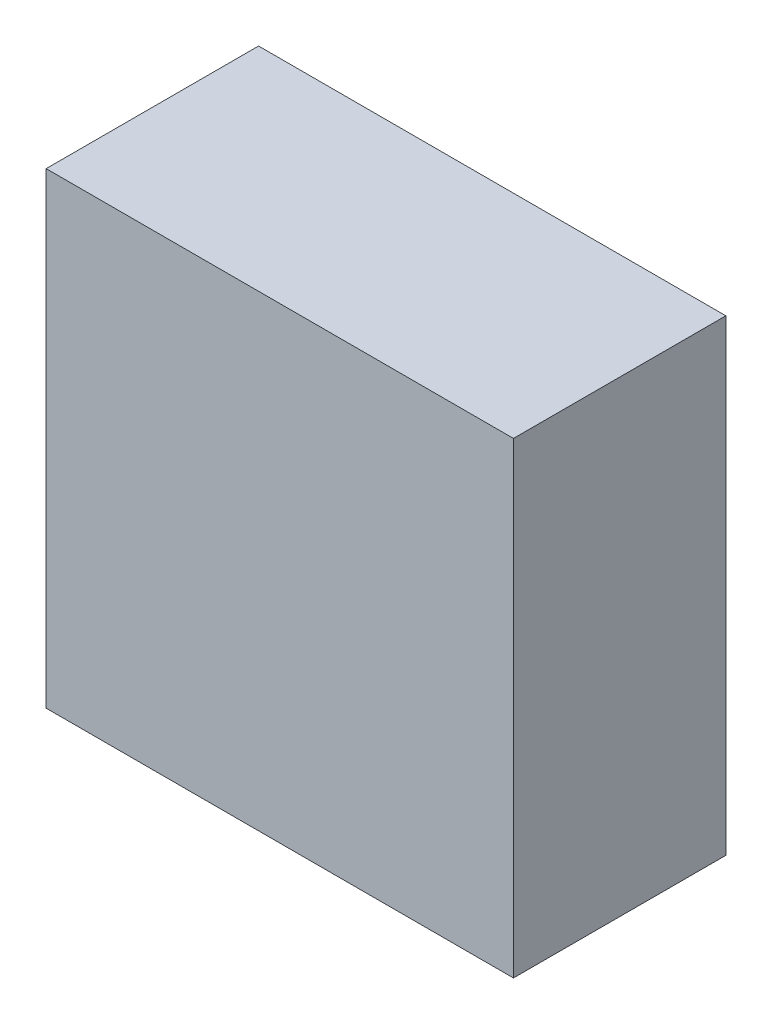
ISO-10303-21;
HEADER;
FILE_DESCRIPTION(('STEP AP214'),'2;1');
FILE_NAME('part.step','',(''),(''),'','','');
FILE_SCHEMA(('AUTOMOTIVE_DESIGN { 1 0 10303 214 1 1 1 1 }'));
ENDSEC;
DATA;
#1=APPLICATION_CONTEXT('core data for automotive mechanical design processes');
#2=APPLICATION_PROTOCOL_DEFINITION('international standard','automotive_design',2000,#1);
#3=PRODUCT_CONTEXT('',#1,'mechanical');
#4=PRODUCT('Part','Part','',(#3));
#5=PRODUCT_RELATED_PRODUCT_CATEGORY('part','',(#4));
#6=PRODUCT_DEFINITION_FORMATION('','',#4);
#7=PRODUCT_DEFINITION_CONTEXT('part definition',#1,'design');
#8=PRODUCT_DEFINITION('design','',#6,#7);
#9=PRODUCT_DEFINITION_SHAPE('','',#8);
#10=(LENGTH_UNIT() NAMED_UNIT(*) SI_UNIT(.MILLI.,.METRE.));
#11=(NAMED_UNIT(*) PLANE_ANGLE_UNIT() SI_UNIT($,.RADIAN.));
#12=(NAMED_UNIT(*) SI_UNIT($,.STERADIAN.) SOLID_ANGLE_UNIT());
#13=UNCERTAINTY_MEASURE_WITH_UNIT(LENGTH_MEASURE(1.E-05),#10,'distance_accuracy_value','');
#14=(GEOMETRIC_REPRESENTATION_CONTEXT(3) GLOBAL_UNCERTAINTY_ASSIGNED_CONTEXT((#13)) GLOBAL_UNIT_ASSIGNED_CONTEXT((#10,
#11,#12)) REPRESENTATION_CONTEXT('',''));
#15=CARTESIAN_POINT('',(0.,0.,0.));
#16=DIRECTION('',(0.,0.,1.));
#17=DIRECTION('',(1.,0.,0.));
#18=AXIS2_PLACEMENT_3D('',#15,#16,#17);
#19=CARTESIAN_POINT('',(0.,0.,5.));
#20=DIRECTION('',(1.,0.,0.));
#21=DIRECTION('',(0.,0.,-1.));
#22=AXIS2_PLACEMENT_3D('',#19,#20,#21);
#23=PLANE('',#22);
#24=DIRECTION('',(0.,-1.,0.));
#25=VECTOR('',#24,1.);
#26=CARTESIAN_POINT('',(0.,0.,0.));
#27=LINE('',#26,#25);
#28=CARTESIAN_POINT('',(0.,11.,0.));
#29=VERTEX_POINT('',#28);
#30=CARTESIAN_POINT('',(0.,0.,0.));
#31=VERTEX_POINT('',#30);
#32=EDGE_CURVE('E100',#29,#31,#27,.T.);
#33=ORIENTED_EDGE('',*,*,#32,.T.);
#34=DIRECTION('',(0.,0.,-1.));
#35=VECTOR('',#34,1.);
#36=CARTESIAN_POINT('',(0.,0.,5.));
#37=LINE('',#36,#35);
#38=CARTESIAN_POINT('',(0.,0.,5.));
#39=VERTEX_POINT('',#38);
#40=EDGE_CURVE('E11',#39,#31,#37,.T.);
#41=ORIENTED_EDGE('',*,*,#40,.F.);
#42=DIRECTION('',(0.,-1.,0.));
#43=VECTOR('',#42,1.);
#44=CARTESIAN_POINT('',(0.,0.,5.));
#45=LINE('',#44,#43);
#46=CARTESIAN_POINT('',(0.,11.,5.));
#47=VERTEX_POINT('',#46);
#48=EDGE_CURVE('E88',#47,#39,#45,.T.);
#49=ORIENTED_EDGE('',*,*,#48,.F.);
#50=DIRECTION('',(0.,0.,-1.));
#51=VECTOR('',#50,1.);
#52=CARTESIAN_POINT('',(0.,11.,5.));
#53=LINE('',#52,#51);
#54=EDGE_CURVE('E96',#47,#29,#53,.T.);
#55=ORIENTED_EDGE('',*,*,#54,.T.);
#56=EDGE_LOOP('',(#33,#41,#49,#55));
#57=FACE_BOUND('',#56,.T.);
#58=ADVANCED_FACE('F37',(#57),#23,.F.);
#59=CARTESIAN_POINT('',(0.,0.,5.));
#60=DIRECTION('',(0.,1.,0.));
#61=DIRECTION('',(0.,0.,1.));
#62=AXIS2_PLACEMENT_3D('',#59,#60,#61);
#63=PLANE('',#62);
#64=DIRECTION('',(1.,0.,0.));
#65=VECTOR('',#64,1.);
#66=CARTESIAN_POINT('',(0.,0.,0.));
#67=LINE('',#66,#65);
#68=CARTESIAN_POINT('',(11.,0.,0.));
#69=VERTEX_POINT('',#68);
#70=EDGE_CURVE('E92',#31,#69,#67,.T.);
#71=ORIENTED_EDGE('',*,*,#70,.T.);
#72=DIRECTION('',(0.,0.,-1.));
#73=VECTOR('',#72,1.);
#74=CARTESIAN_POINT('',(11.,0.,5.));
#75=LINE('',#74,#73);
#76=CARTESIAN_POINT('',(11.,0.,5.));
#77=VERTEX_POINT('',#76);
#78=EDGE_CURVE('E45',#77,#69,#75,.T.);
#79=ORIENTED_EDGE('',*,*,#78,.F.);
#80=DIRECTION('',(1.,0.,0.));
#81=VECTOR('',#80,1.);
#82=CARTESIAN_POINT('',(0.,0.,5.));
#83=LINE('',#82,#81);
#84=EDGE_CURVE('E83',#39,#77,#83,.T.);
#85=ORIENTED_EDGE('',*,*,#84,.F.);
#86=ORIENTED_EDGE('',*,*,#40,.T.);
#87=EDGE_LOOP('',(#71,#79,#85,#86));
#88=FACE_BOUND('',#87,.T.);
#89=ADVANCED_FACE('F91',(#88),#63,.F.);
#90=CARTESIAN_POINT('',(11.,0.,5.));
#91=DIRECTION('',(-1.,0.,0.));
#92=DIRECTION('',(0.,0.,1.));
#93=AXIS2_PLACEMENT_3D('',#90,#91,#92);
#94=PLANE('',#93);
#95=DIRECTION('',(0.,1.,0.));
#96=VECTOR('',#95,1.);
#97=CARTESIAN_POINT('',(11.,0.,0.));
#98=LINE('',#97,#96);
#99=CARTESIAN_POINT('',(11.,11.,0.));
#100=VERTEX_POINT('',#99);
#101=EDGE_CURVE('E70',#69,#100,#98,.T.);
#102=ORIENTED_EDGE('',*,*,#101,.T.);
#103=DIRECTION('',(0.,0.,-1.));
#104=VECTOR('',#103,1.);
#105=CARTESIAN_POINT('',(11.,11.,5.));
#106=LINE('',#105,#104);
#107=CARTESIAN_POINT('',(11.,11.,5.));
#108=VERTEX_POINT('',#107);
#109=EDGE_CURVE('E93',#108,#100,#106,.T.);
#110=ORIENTED_EDGE('',*,*,#109,.F.);
#111=DIRECTION('',(0.,1.,0.));
#112=VECTOR('',#111,1.);
#113=CARTESIAN_POINT('',(11.,0.,5.));
#114=LINE('',#113,#112);
#115=EDGE_CURVE('E86',#77,#108,#114,.T.);
#116=ORIENTED_EDGE('',*,*,#115,.F.);
#117=ORIENTED_EDGE('',*,*,#78,.T.);
#118=EDGE_LOOP('',(#102,#110,#116,#117));
#119=FACE_BOUND('',#118,.T.);
#120=ADVANCED_FACE('F94',(#119),#94,.F.);
#121=CARTESIAN_POINT('',(0.,11.,5.));
#122=DIRECTION('',(0.,-1.,0.));
#123=DIRECTION('',(0.,0.,-1.));
#124=AXIS2_PLACEMENT_3D('',#121,#122,#123);
#125=PLANE('',#124);
#126=DIRECTION('',(-1.,0.,0.));
#127=VECTOR('',#126,1.);
#128=CARTESIAN_POINT('',(0.,11.,0.));
#129=LINE('',#128,#127);
#130=EDGE_CURVE('E76',#100,#29,#129,.T.);
#131=ORIENTED_EDGE('',*,*,#130,.T.);
#132=ORIENTED_EDGE('',*,*,#54,.F.);
#133=DIRECTION('',(-1.,0.,0.));
#134=VECTOR('',#133,1.);
#135=CARTESIAN_POINT('',(0.,11.,5.));
#136=LINE('',#135,#134);
#137=EDGE_CURVE('E53',#108,#47,#136,.T.);
#138=ORIENTED_EDGE('',*,*,#137,.F.);
#139=ORIENTED_EDGE('',*,*,#109,.T.);
#140=EDGE_LOOP('',(#131,#132,#138,#139));
#141=FACE_BOUND('',#140,.T.);
#142=ADVANCED_FACE('F107',(#141),#125,.F.);
#143=CARTESIAN_POINT('',(0.,0.,5.));
#144=DIRECTION('',(0.,0.,-1.));
#145=DIRECTION('',(-1.,0.,0.));
#146=AXIS2_PLACEMENT_3D('',#143,#144,#145);
#147=PLANE('',#146);
#148=ORIENTED_EDGE('',*,*,#48,.T.);
#149=ORIENTED_EDGE('',*,*,#84,.T.);
#150=ORIENTED_EDGE('',*,*,#115,.T.);
#151=ORIENTED_EDGE('',*,*,#137,.T.);
#152=EDGE_LOOP('',(#148,#149,#150,#151));
#153=FACE_BOUND('',#152,.T.);
#154=ADVANCED_FACE('F84',(#153),#147,.F.);
#155=CARTESIAN_POINT('',(0.,0.,0.));
#156=DIRECTION('',(0.,0.,-1.));
#157=DIRECTION('',(-1.,0.,0.));
#158=AXIS2_PLACEMENT_3D('',#155,#156,#157);
#159=PLANE('',#158);
#160=ORIENTED_EDGE('',*,*,#32,.F.);
#161=ORIENTED_EDGE('',*,*,#130,.F.);
#162=ORIENTED_EDGE('',*,*,#101,.F.);
#163=ORIENTED_EDGE('',*,*,#70,.F.);
#164=EDGE_LOOP('',(#160,#161,#162,#163));
#165=FACE_BOUND('',#164,.T.);
#166=ADVANCED_FACE('F110',(#165),#159,.T.);
#167=CLOSED_SHELL('',(#58,#89,#120,#142,#154,#166));
#168=MANIFOLD_SOLID_BREP('B2',#167);
#169=ADVANCED_BREP_SHAPE_REPRESENTATION('',(#18,#168),#14);
#170=SHAPE_DEFINITION_REPRESENTATION(#9,#169);
ENDSEC;
END-ISO-10303-21;
